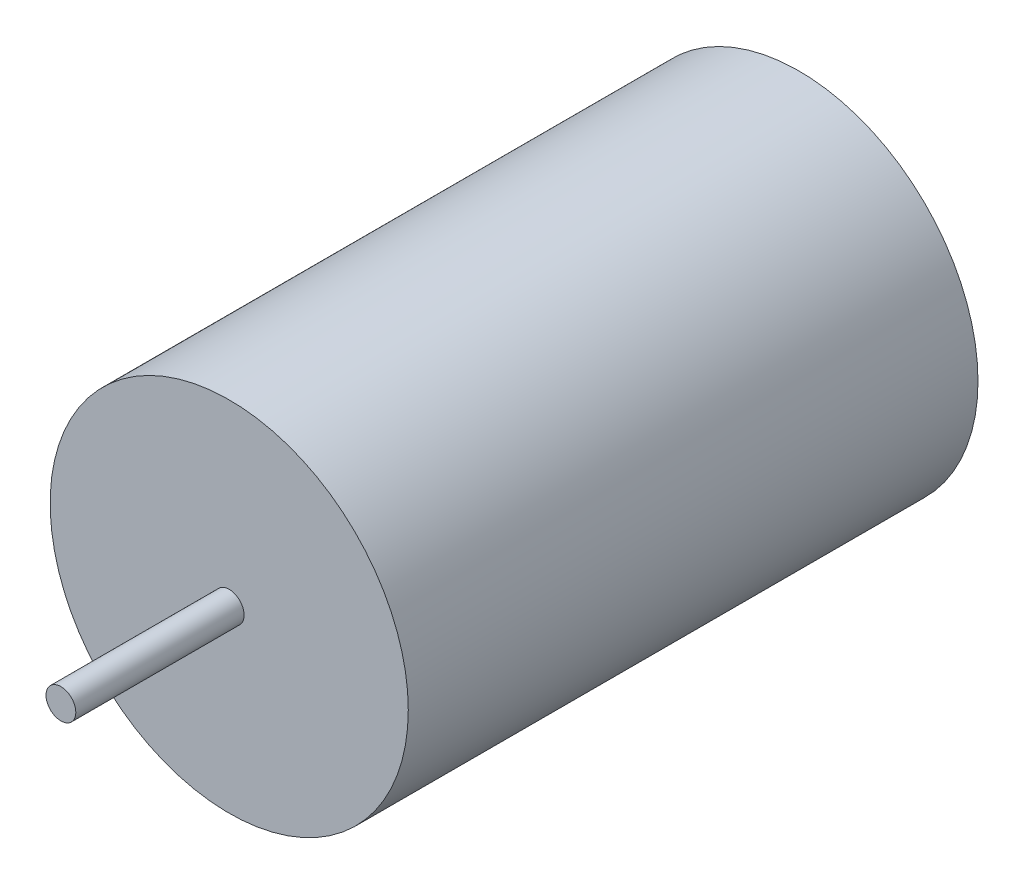
ISO-10303-21;
HEADER;
FILE_DESCRIPTION(('STEP AP214'),'2;1');
FILE_NAME('part.step','',(''),(''),'','','');
FILE_SCHEMA(('AUTOMOTIVE_DESIGN { 1 0 10303 214 1 1 1 1 }'));
ENDSEC;
DATA;
#1=APPLICATION_CONTEXT('core data for automotive mechanical design processes');
#2=APPLICATION_PROTOCOL_DEFINITION('international standard','automotive_design',2000,#1);
#3=PRODUCT_CONTEXT('',#1,'mechanical');
#4=PRODUCT('Part','Part','',(#3));
#5=PRODUCT_RELATED_PRODUCT_CATEGORY('part','',(#4));
#6=PRODUCT_DEFINITION_FORMATION('','',#4);
#7=PRODUCT_DEFINITION_CONTEXT('part definition',#1,'design');
#8=PRODUCT_DEFINITION('design','',#6,#7);
#9=PRODUCT_DEFINITION_SHAPE('','',#8);
#10=(LENGTH_UNIT() NAMED_UNIT(*) SI_UNIT(.MILLI.,.METRE.));
#11=(NAMED_UNIT(*) PLANE_ANGLE_UNIT() SI_UNIT($,.RADIAN.));
#12=(NAMED_UNIT(*) SI_UNIT($,.STERADIAN.) SOLID_ANGLE_UNIT());
#13=UNCERTAINTY_MEASURE_WITH_UNIT(LENGTH_MEASURE(1.E-05),#10,'distance_accuracy_value','');
#14=(GEOMETRIC_REPRESENTATION_CONTEXT(3) GLOBAL_UNCERTAINTY_ASSIGNED_CONTEXT((#13)) GLOBAL_UNIT_ASSIGNED_CONTEXT((#10,
#11,#12)) REPRESENTATION_CONTEXT('',''));
#15=CARTESIAN_POINT('',(0.,0.,0.));
#16=DIRECTION('',(0.,0.,1.));
#17=DIRECTION('',(1.,0.,0.));
#18=AXIS2_PLACEMENT_3D('',#15,#16,#17);
#19=CARTESIAN_POINT('',(0.,0.,44.));
#20=DIRECTION('',(0.,0.,-1.));
#21=DIRECTION('',(-1.,0.,0.));
#22=AXIS2_PLACEMENT_3D('',#19,#20,#21);
#23=CYLINDRICAL_SURFACE('',#22,13.83);
#24=CARTESIAN_POINT('',(0.,0.,44.));
#25=DIRECTION('',(0.,0.,1.));
#26=DIRECTION('',(1.,0.,0.));
#27=AXIS2_PLACEMENT_3D('',#24,#25,#26);
#28=CIRCLE('',#27,13.83);
#29=CARTESIAN_POINT('',(13.83,0.,44.));
#30=VERTEX_POINT('',#29);
#31=EDGE_CURVE('E10',#30,#30,#28,.T.);
#32=ORIENTED_EDGE('',*,*,#31,.F.);
#33=EDGE_LOOP('',(#32));
#34=FACE_BOUND('',#33,.T.);
#35=CARTESIAN_POINT('',(0.,0.,0.));
#36=DIRECTION('',(0.,0.,1.));
#37=DIRECTION('',(1.,0.,0.));
#38=AXIS2_PLACEMENT_3D('',#35,#36,#37);
#39=CIRCLE('',#38,13.83);
#40=CARTESIAN_POINT('',(13.83,0.,0.));
#41=VERTEX_POINT('',#40);
#42=EDGE_CURVE('E40',#41,#41,#39,.T.);
#43=ORIENTED_EDGE('',*,*,#42,.T.);
#44=EDGE_LOOP('',(#43));
#45=FACE_BOUND('',#44,.T.);
#46=ADVANCED_FACE('F37',(#34,#45),#23,.T.);
#47=CARTESIAN_POINT('',(0.,0.,44.));
#48=DIRECTION('',(0.,0.,1.));
#49=DIRECTION('',(1.,0.,0.));
#50=AXIS2_PLACEMENT_3D('',#47,#48,#49);
#51=PLANE('',#50);
#52=CARTESIAN_POINT('',(0.,0.,44.));
#53=DIRECTION('',(0.,0.,1.));
#54=DIRECTION('',(1.,0.,0.));
#55=AXIS2_PLACEMENT_3D('',#52,#53,#54);
#56=CIRCLE('',#55,1.15);
#57=CARTESIAN_POINT('',(-1.15,0.,44.));
#58=VERTEX_POINT('',#57);
#59=EDGE_CURVE('E51',#58,#58,#56,.T.);
#60=ORIENTED_EDGE('',*,*,#59,.F.);
#61=EDGE_LOOP('',(#60));
#62=FACE_BOUND('',#61,.T.);
#63=ORIENTED_EDGE('',*,*,#31,.T.);
#64=EDGE_LOOP('',(#63));
#65=FACE_BOUND('',#64,.T.);
#66=ADVANCED_FACE('F68',(#62,#65),#51,.T.);
#67=CARTESIAN_POINT('',(0.,0.,0.));
#68=DIRECTION('',(0.,0.,1.));
#69=DIRECTION('',(1.,0.,0.));
#70=AXIS2_PLACEMENT_3D('',#67,#68,#69);
#71=PLANE('',#70);
#72=ORIENTED_EDGE('',*,*,#42,.F.);
#73=EDGE_LOOP('',(#72));
#74=FACE_BOUND('',#73,.T.);
#75=ADVANCED_FACE('F64',(#74),#71,.F.);
#76=CARTESIAN_POINT('',(0.,0.,57.));
#77=DIRECTION('',(0.,0.,-1.));
#78=DIRECTION('',(-1.,0.,0.));
#79=AXIS2_PLACEMENT_3D('',#76,#77,#78);
#80=CYLINDRICAL_SURFACE('',#79,1.15);
#81=CARTESIAN_POINT('',(0.,0.,57.));
#82=DIRECTION('',(0.,0.,1.));
#83=DIRECTION('',(1.,0.,0.));
#84=AXIS2_PLACEMENT_3D('',#81,#82,#83);
#85=CIRCLE('',#84,1.15);
#86=CARTESIAN_POINT('',(-1.15,0.,57.));
#87=VERTEX_POINT('',#86);
#88=EDGE_CURVE('E49',#87,#87,#85,.T.);
#89=CARTESIAN_POINT('',(-1.15,0.,57.));
#90=CARTESIAN_POINT('',(-1.15,0.,56.8645833333333));
#91=CARTESIAN_POINT('',(-1.15,0.,56.7291666666667));
#92=CARTESIAN_POINT('',(-1.15,0.,56.4583333333333));
#93=CARTESIAN_POINT('',(-1.15,0.,56.3229166666667));
#94=CARTESIAN_POINT('',(-1.15,0.,56.0520833333333));
#95=CARTESIAN_POINT('',(-1.15,0.,55.9166666666667));
#96=CARTESIAN_POINT('',(-1.15,0.,55.6458333333333));
#97=CARTESIAN_POINT('',(-1.15,0.,55.5104166666667));
#98=CARTESIAN_POINT('',(-1.15,0.,55.2395833333333));
#99=CARTESIAN_POINT('',(-1.15,0.,55.1041666666667));
#100=CARTESIAN_POINT('',(-1.15,0.,54.8333333333333));
#101=CARTESIAN_POINT('',(-1.15,0.,54.6979166666667));
#102=CARTESIAN_POINT('',(-1.15,0.,54.4270833333333));
#103=CARTESIAN_POINT('',(-1.15,0.,54.2916666666667));
#104=CARTESIAN_POINT('',(-1.15,0.,54.0208333333333));
#105=CARTESIAN_POINT('',(-1.15,0.,53.8854166666667));
#106=CARTESIAN_POINT('',(-1.15,0.,53.6145833333333));
#107=CARTESIAN_POINT('',(-1.15,0.,53.4791666666667));
#108=CARTESIAN_POINT('',(-1.15,0.,53.2083333333333));
#109=CARTESIAN_POINT('',(-1.15,0.,53.0729166666667));
#110=CARTESIAN_POINT('',(-1.15,0.,52.8020833333333));
#111=CARTESIAN_POINT('',(-1.15,0.,52.6666666666667));
#112=CARTESIAN_POINT('',(-1.15,0.,52.3958333333333));
#113=CARTESIAN_POINT('',(-1.15,0.,52.2604166666667));
#114=CARTESIAN_POINT('',(-1.15,0.,51.9895833333333));
#115=CARTESIAN_POINT('',(-1.15,0.,51.8541666666667));
#116=CARTESIAN_POINT('',(-1.15,0.,51.5833333333333));
#117=CARTESIAN_POINT('',(-1.15,0.,51.4479166666667));
#118=CARTESIAN_POINT('',(-1.15,0.,51.1770833333333));
#119=CARTESIAN_POINT('',(-1.15,0.,51.0416666666667));
#120=CARTESIAN_POINT('',(-1.15,0.,50.7708333333333));
#121=CARTESIAN_POINT('',(-1.15,0.,50.6354166666667));
#122=CARTESIAN_POINT('',(-1.15,0.,50.3645833333333));
#123=CARTESIAN_POINT('',(-1.15,0.,50.2291666666667));
#124=CARTESIAN_POINT('',(-1.15,0.,49.9583333333333));
#125=CARTESIAN_POINT('',(-1.15,0.,49.8229166666667));
#126=CARTESIAN_POINT('',(-1.15,0.,49.5520833333333));
#127=CARTESIAN_POINT('',(-1.15,0.,49.4166666666667));
#128=CARTESIAN_POINT('',(-1.15,0.,49.1458333333333));
#129=CARTESIAN_POINT('',(-1.15,0.,49.0104166666667));
#130=CARTESIAN_POINT('',(-1.15,0.,48.7395833333333));
#131=CARTESIAN_POINT('',(-1.15,0.,48.6041666666667));
#132=CARTESIAN_POINT('',(-1.15,0.,48.3333333333333));
#133=CARTESIAN_POINT('',(-1.15,0.,48.1979166666667));
#134=CARTESIAN_POINT('',(-1.15,0.,47.9270833333333));
#135=CARTESIAN_POINT('',(-1.15,0.,47.7916666666667));
#136=CARTESIAN_POINT('',(-1.15,0.,47.5208333333333));
#137=CARTESIAN_POINT('',(-1.15,0.,47.3854166666667));
#138=CARTESIAN_POINT('',(-1.15,0.,47.1145833333333));
#139=CARTESIAN_POINT('',(-1.15,0.,46.9791666666667));
#140=CARTESIAN_POINT('',(-1.15,0.,46.7083333333333));
#141=CARTESIAN_POINT('',(-1.15,0.,46.5729166666667));
#142=CARTESIAN_POINT('',(-1.15,0.,46.3020833333333));
#143=CARTESIAN_POINT('',(-1.15,0.,46.1666666666667));
#144=CARTESIAN_POINT('',(-1.15,0.,45.8958333333333));
#145=CARTESIAN_POINT('',(-1.15,0.,45.7604166666667));
#146=CARTESIAN_POINT('',(-1.15,0.,45.4895833333333));
#147=CARTESIAN_POINT('',(-1.15,0.,45.3541666666667));
#148=CARTESIAN_POINT('',(-1.15,0.,45.0833333333333));
#149=CARTESIAN_POINT('',(-1.15,0.,44.9479166666667));
#150=CARTESIAN_POINT('',(-1.15,0.,44.6770833333333));
#151=CARTESIAN_POINT('',(-1.15,0.,44.5416666666667));
#152=CARTESIAN_POINT('',(-1.15,0.,44.2708333333333));
#153=CARTESIAN_POINT('',(-1.15,0.,44.1354166666667));
#154=CARTESIAN_POINT('',(-1.15,0.,44.));
#155=B_SPLINE_CURVE_WITH_KNOTS('',3,(#89,#90,#91,#92,#93,#94,#95,#96,#97,#98,#99,#100,#101,#102,
#103,#104,#105,#106,#107,#108,#109,#110,#111,#112,#113,#114,#115,#116,#117,#118,#119,#120,#121,
#122,#123,#124,#125,#126,#127,#128,#129,#130,#131,#132,#133,#134,#135,#136,#137,#138,#139,#140,
#141,#142,#143,#144,#145,#146,#147,#148,#149,#150,#151,#152,#153,#154),.UNSPECIFIED.,.F.,.F.,(4,
2,2,2,2,2,2,2,2,2,2,2,2,2,2,2,2,2,2,2,2,2,2,2,2,2,2,2,2,2,2,2,4),(0.,0.406250000000004,
0.812500000000001,1.21875,1.625,2.03125000000001,2.4375,2.84375000000001,3.25,3.65625,4.0625,
4.46875,4.875,5.28125,5.68750000000001,6.09375,6.50000000000001,6.90625,7.3125,7.71875,8.125,
8.53125,8.9375,9.34375000000001,9.75,10.15625,10.5625,10.96875,11.375,11.78125,12.1875,12.59375,
13.),.UNSPECIFIED.);
#156=EDGE_CURVE('BSEAM61',#87,#58,#155,.T.);
#157=ORIENTED_EDGE('',*,*,#88,.F.);
#158=ORIENTED_EDGE('',*,*,#59,.T.);
#159=ORIENTED_EDGE('',*,*,#156,.T.);
#160=ORIENTED_EDGE('',*,*,#156,.F.);
#161=EDGE_LOOP('',(#157,#159,#158,#160));
#162=FACE_BOUND('',#161,.T.);
#163=ADVANCED_FACE('F61',(#162),#80,.T.);
#164=CARTESIAN_POINT('',(0.,0.,57.));
#165=DIRECTION('',(0.,0.,1.));
#166=DIRECTION('',(1.,0.,0.));
#167=AXIS2_PLACEMENT_3D('',#164,#165,#166);
#168=PLANE('',#167);
#169=ORIENTED_EDGE('',*,*,#88,.T.);
#170=EDGE_LOOP('',(#169));
#171=FACE_BOUND('',#170,.T.);
#172=ADVANCED_FACE('F59',(#171),#168,.T.);
#173=CLOSED_SHELL('',(#46,#66,#75,#163,#172));
#174=MANIFOLD_SOLID_BREP('B2',#173);
#175=ADVANCED_BREP_SHAPE_REPRESENTATION('',(#18,#174),#14);
#176=SHAPE_DEFINITION_REPRESENTATION(#9,#175);
ENDSEC;
END-ISO-10303-21;
